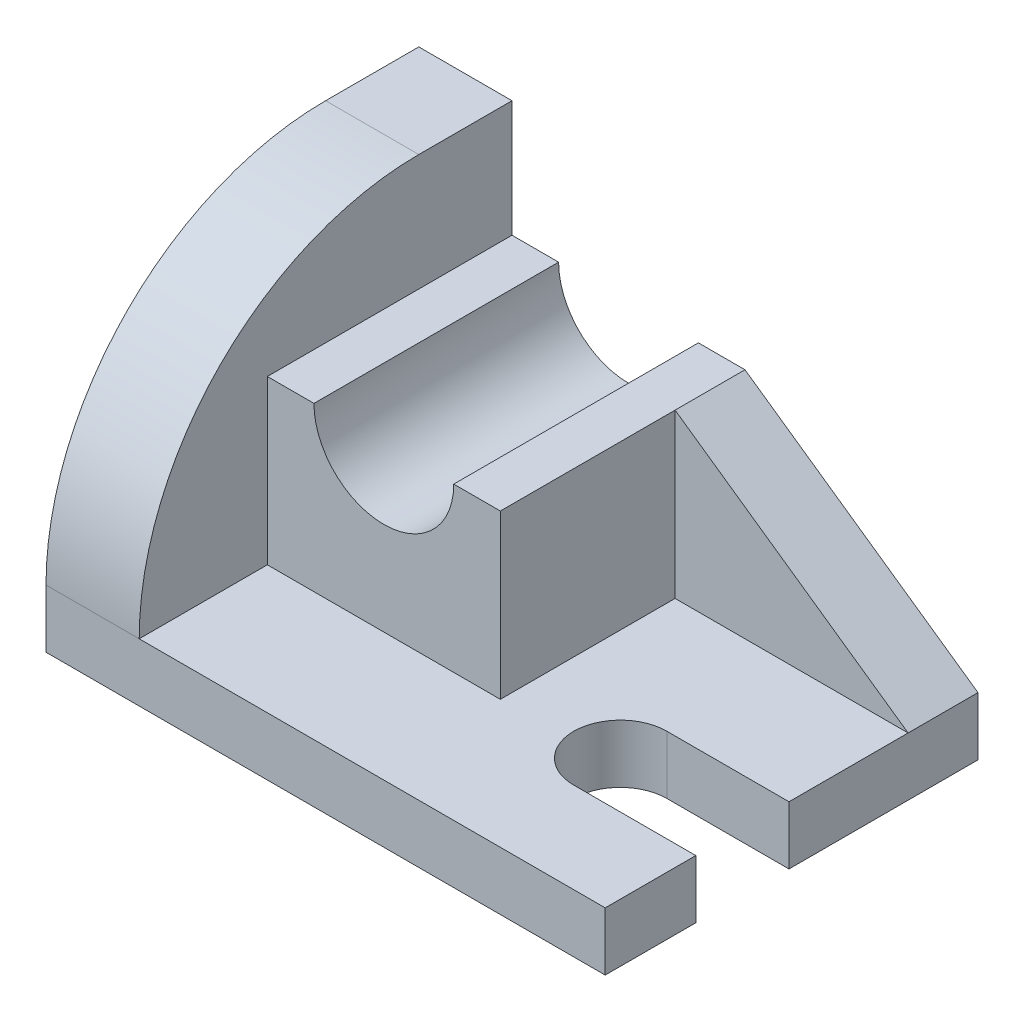
ISO-10303-21;
HEADER;
FILE_DESCRIPTION(('STEP AP214'),'2;1');
FILE_NAME('part.step','',(''),(''),'','','');
FILE_SCHEMA(('AUTOMOTIVE_DESIGN { 1 0 10303 214 1 1 1 1 }'));
ENDSEC;
DATA;
#1=APPLICATION_CONTEXT('core data for automotive mechanical design processes');
#2=APPLICATION_PROTOCOL_DEFINITION('international standard','automotive_design',2000,#1);
#3=PRODUCT_CONTEXT('',#1,'mechanical');
#4=PRODUCT('Part','Part','',(#3));
#5=PRODUCT_RELATED_PRODUCT_CATEGORY('part','',(#4));
#6=PRODUCT_DEFINITION_FORMATION('','',#4);
#7=PRODUCT_DEFINITION_CONTEXT('part definition',#1,'design');
#8=PRODUCT_DEFINITION('design','',#6,#7);
#9=PRODUCT_DEFINITION_SHAPE('','',#8);
#10=(LENGTH_UNIT() NAMED_UNIT(*) SI_UNIT(.MILLI.,.METRE.));
#11=(NAMED_UNIT(*) PLANE_ANGLE_UNIT() SI_UNIT($,.RADIAN.));
#12=(NAMED_UNIT(*) SI_UNIT($,.STERADIAN.) SOLID_ANGLE_UNIT());
#13=UNCERTAINTY_MEASURE_WITH_UNIT(LENGTH_MEASURE(1.E-05),#10,'distance_accuracy_value','');
#14=(GEOMETRIC_REPRESENTATION_CONTEXT(3) GLOBAL_UNCERTAINTY_ASSIGNED_CONTEXT((#13)) GLOBAL_UNIT_ASSIGNED_CONTEXT((#10,
#11,#12)) REPRESENTATION_CONTEXT('',''));
#15=CARTESIAN_POINT('',(0.,0.,0.));
#16=DIRECTION('',(0.,0.,1.));
#17=DIRECTION('',(1.,0.,0.));
#18=AXIS2_PLACEMENT_3D('',#15,#16,#17);
#19=CARTESIAN_POINT('',(16.,58.,-64.));
#20=DIRECTION('',(1.,0.,0.));
#21=DIRECTION('',(0.,1.,0.));
#22=AXIS2_PLACEMENT_3D('',#19,#20,#21);
#23=PLANE('',#22);
#24=DIRECTION('',(0.,-1.,0.));
#25=VECTOR('',#24,1.);
#26=CARTESIAN_POINT('',(16.,10.,-22.));
#27=LINE('',#26,#25);
#28=CARTESIAN_POINT('',(16.,38.,-22.));
#29=VERTEX_POINT('',#28);
#30=CARTESIAN_POINT('',(16.,10.,-22.));
#31=VERTEX_POINT('',#30);
#32=EDGE_CURVE('E49',#29,#31,#27,.T.);
#33=ORIENTED_EDGE('',*,*,#32,.F.);
#34=DIRECTION('',(0.,0.,-1.));
#35=VECTOR('',#34,1.);
#36=CARTESIAN_POINT('',(16.,38.,-22.));
#37=LINE('',#36,#35);
#38=CARTESIAN_POINT('',(16.,38.,-64.));
#39=VERTEX_POINT('',#38);
#40=EDGE_CURVE('E54',#29,#39,#37,.T.);
#41=ORIENTED_EDGE('',*,*,#40,.T.);
#42=DIRECTION('',(0.,1.,0.));
#43=VECTOR('',#42,1.);
#44=CARTESIAN_POINT('',(16.,58.,-64.));
#45=LINE('',#44,#43);
#46=CARTESIAN_POINT('',(16.,58.,-64.));
#47=VERTEX_POINT('',#46);
#48=EDGE_CURVE('E198',#39,#47,#45,.T.);
#49=ORIENTED_EDGE('',*,*,#48,.T.);
#50=DIRECTION('',(0.,0.,1.));
#51=VECTOR('',#50,1.);
#52=CARTESIAN_POINT('',(16.,58.,-64.));
#53=LINE('',#52,#51);
#54=CARTESIAN_POINT('',(16.,58.,-48.));
#55=VERTEX_POINT('',#54);
#56=EDGE_CURVE('E208',#47,#55,#53,.T.);
#57=ORIENTED_EDGE('',*,*,#56,.T.);
#58=CARTESIAN_POINT('',(16.,10.,-48.));
#59=DIRECTION('',(1.,0.,0.));
#60=DIRECTION('',(0.,1.,0.));
#61=AXIS2_PLACEMENT_3D('',#58,#59,#60);
#62=CIRCLE('',#61,48.);
#63=CARTESIAN_POINT('',(16.,10.,0.));
#64=VERTEX_POINT('',#63);
#65=EDGE_CURVE('E189',#55,#64,#62,.T.);
#66=ORIENTED_EDGE('',*,*,#65,.T.);
#67=DIRECTION('',(0.,0.,1.));
#68=VECTOR('',#67,1.);
#69=CARTESIAN_POINT('',(16.,10.,-64.));
#70=LINE('',#69,#68);
#71=EDGE_CURVE('E203',#31,#64,#70,.T.);
#72=ORIENTED_EDGE('',*,*,#71,.F.);
#73=EDGE_LOOP('',(#33,#41,#49,#57,#66,#72));
#74=FACE_BOUND('',#73,.T.);
#75=ADVANCED_FACE('F33',(#74),#23,.T.);
#76=CARTESIAN_POINT('',(0.,10.,0.));
#77=DIRECTION('',(0.,-1.,0.));
#78=DIRECTION('',(0.,0.,-1.));
#79=AXIS2_PLACEMENT_3D('',#76,#77,#78);
#80=PLANE('',#79);
#81=DIRECTION('',(0.,0.,-1.));
#82=VECTOR('',#81,1.);
#83=CARTESIAN_POINT('',(96.,10.,-64.));
#84=LINE('',#83,#82);
#85=CARTESIAN_POINT('',(96.,10.,-31.5509225220339));
#86=VERTEX_POINT('',#85);
#87=CARTESIAN_POINT('',(96.,10.,-52.));
#88=VERTEX_POINT('',#87);
#89=EDGE_CURVE('E240',#86,#88,#84,.T.);
#90=ORIENTED_EDGE('',*,*,#89,.T.);
#91=DIRECTION('',(-1.,0.,0.));
#92=VECTOR('',#91,1.);
#93=CARTESIAN_POINT('',(96.,10.,-52.));
#94=LINE('',#93,#92);
#95=CARTESIAN_POINT('',(56.,10.,-52.));
#96=VERTEX_POINT('',#95);
#97=EDGE_CURVE('E161',#88,#96,#94,.T.);
#98=ORIENTED_EDGE('',*,*,#97,.T.);
#99=DIRECTION('',(0.,0.,-1.));
#100=VECTOR('',#99,1.);
#101=CARTESIAN_POINT('',(56.,10.,-22.));
#102=LINE('',#101,#100);
#103=CARTESIAN_POINT('',(56.,10.,-22.));
#104=VERTEX_POINT('',#103);
#105=EDGE_CURVE('E177',#104,#96,#102,.T.);
#106=ORIENTED_EDGE('',*,*,#105,.F.);
#107=DIRECTION('',(1.,0.,0.));
#108=VECTOR('',#107,1.);
#109=CARTESIAN_POINT('',(0.,10.,-22.));
#110=LINE('',#109,#108);
#111=EDGE_CURVE('E323',#31,#104,#110,.T.);
#112=ORIENTED_EDGE('',*,*,#111,.F.);
#113=ORIENTED_EDGE('',*,*,#71,.T.);
#114=DIRECTION('',(1.,0.,0.));
#115=VECTOR('',#114,1.);
#116=CARTESIAN_POINT('',(96.,10.,0.));
#117=LINE('',#116,#115);
#118=CARTESIAN_POINT('',(96.,10.,0.));
#119=VERTEX_POINT('',#118);
#120=EDGE_CURVE('E238',#64,#119,#117,.T.);
#121=ORIENTED_EDGE('',*,*,#120,.T.);
#122=CARTESIAN_POINT('',(96.,10.,-15.5509225220339));
#123=VERTEX_POINT('',#122);
#124=EDGE_CURVE('E242',#119,#123,#84,.T.);
#125=ORIENTED_EDGE('',*,*,#124,.T.);
#126=DIRECTION('',(1.,0.,0.));
#127=VECTOR('',#126,1.);
#128=CARTESIAN_POINT('',(96.,10.,-15.5509225220339));
#129=LINE('',#128,#127);
#130=CARTESIAN_POINT('',(75.0432997423729,10.,-15.5509225220339));
#131=VERTEX_POINT('',#130);
#132=EDGE_CURVE('E207',#131,#123,#129,.T.);
#133=ORIENTED_EDGE('',*,*,#132,.F.);
#134=CARTESIAN_POINT('',(75.0432997423729,10.,-23.5509225220339));
#135=DIRECTION('',(0.,1.,0.));
#136=DIRECTION('',(0.,0.,1.));
#137=AXIS2_PLACEMENT_3D('',#134,#135,#136);
#138=CIRCLE('',#137,8.);
#139=CARTESIAN_POINT('',(75.0432997423729,10.,-31.5509225220339));
#140=VERTEX_POINT('',#139);
#141=EDGE_CURVE('E216',#140,#131,#138,.T.);
#142=ORIENTED_EDGE('',*,*,#141,.F.);
#143=DIRECTION('',(-1.,0.,0.));
#144=VECTOR('',#143,1.);
#145=CARTESIAN_POINT('',(96.,10.,-31.5509225220339));
#146=LINE('',#145,#144);
#147=EDGE_CURVE('E224',#86,#140,#146,.T.);
#148=ORIENTED_EDGE('',*,*,#147,.F.);
#149=EDGE_LOOP('',(#90,#98,#106,#112,#113,#121,#125,#133,#142,#148));
#150=FACE_BOUND('',#149,.T.);
#151=ADVANCED_FACE('F291',(#150),#80,.F.);
#152=CARTESIAN_POINT('',(96.,10.,0.));
#153=DIRECTION('',(0.,0.,-1.));
#154=DIRECTION('',(-1.,0.,0.));
#155=AXIS2_PLACEMENT_3D('',#152,#153,#154);
#156=PLANE('',#155);
#157=DIRECTION('',(-1.,0.,0.));
#158=VECTOR('',#157,1.);
#159=CARTESIAN_POINT('',(96.001,10.,0.));
#160=LINE('',#159,#158);
#161=CARTESIAN_POINT('',(0.,10.,0.));
#162=VERTEX_POINT('',#161);
#163=EDGE_CURVE('E192',#64,#162,#160,.T.);
#164=ORIENTED_EDGE('',*,*,#163,.T.);
#165=DIRECTION('',(0.,-1.,0.));
#166=VECTOR('',#165,1.);
#167=CARTESIAN_POINT('',(0.,10.,0.));
#168=LINE('',#167,#166);
#169=CARTESIAN_POINT('',(0.,0.,0.));
#170=VERTEX_POINT('',#169);
#171=EDGE_CURVE('E245',#162,#170,#168,.T.);
#172=ORIENTED_EDGE('',*,*,#171,.T.);
#173=DIRECTION('',(1.,0.,0.));
#174=VECTOR('',#173,1.);
#175=CARTESIAN_POINT('',(96.,0.,0.));
#176=LINE('',#175,#174);
#177=CARTESIAN_POINT('',(96.,0.,0.));
#178=VERTEX_POINT('',#177);
#179=EDGE_CURVE('E231',#170,#178,#176,.T.);
#180=ORIENTED_EDGE('',*,*,#179,.T.);
#181=DIRECTION('',(0.,-1.,0.));
#182=VECTOR('',#181,1.);
#183=CARTESIAN_POINT('',(96.,10.,0.));
#184=LINE('',#183,#182);
#185=EDGE_CURVE('E11',#119,#178,#184,.T.);
#186=ORIENTED_EDGE('',*,*,#185,.F.);
#187=ORIENTED_EDGE('',*,*,#120,.F.);
#188=EDGE_LOOP('',(#164,#172,#180,#186,#187));
#189=FACE_BOUND('',#188,.T.);
#190=ADVANCED_FACE('F35',(#189),#156,.F.);
#191=CARTESIAN_POINT('',(0.,10.,0.));
#192=DIRECTION('',(1.,0.,0.));
#193=DIRECTION('',(0.,0.,-1.));
#194=AXIS2_PLACEMENT_3D('',#191,#192,#193);
#195=PLANE('',#194);
#196=ORIENTED_EDGE('',*,*,#171,.F.);
#197=CARTESIAN_POINT('',(0.,10.,-48.));
#198=DIRECTION('',(-1.,0.,0.));
#199=DIRECTION('',(0.,0.,1.));
#200=AXIS2_PLACEMENT_3D('',#197,#198,#199);
#201=CIRCLE('',#200,48.);
#202=CARTESIAN_POINT('',(0.,58.,-48.));
#203=VERTEX_POINT('',#202);
#204=EDGE_CURVE('E37',#203,#162,#201,.F.);
#205=ORIENTED_EDGE('',*,*,#204,.F.);
#206=DIRECTION('',(0.,0.,1.));
#207=VECTOR('',#206,1.);
#208=CARTESIAN_POINT('',(0.,58.,-64.));
#209=LINE('',#208,#207);
#210=CARTESIAN_POINT('',(0.,58.,-64.));
#211=VERTEX_POINT('',#210);
#212=EDGE_CURVE('E204',#211,#203,#209,.T.);
#213=ORIENTED_EDGE('',*,*,#212,.F.);
#214=DIRECTION('',(0.,-1.,0.));
#215=VECTOR('',#214,1.);
#216=CARTESIAN_POINT('',(0.,10.,-64.));
#217=LINE('',#216,#215);
#218=CARTESIAN_POINT('',(0.,0.,-64.));
#219=VERTEX_POINT('',#218);
#220=EDGE_CURVE('E257',#211,#219,#217,.T.);
#221=ORIENTED_EDGE('',*,*,#220,.T.);
#222=DIRECTION('',(0.,0.,1.));
#223=VECTOR('',#222,1.);
#224=CARTESIAN_POINT('',(0.,0.,0.));
#225=LINE('',#224,#223);
#226=EDGE_CURVE('E241',#219,#170,#225,.T.);
#227=ORIENTED_EDGE('',*,*,#226,.T.);
#228=EDGE_LOOP('',(#196,#205,#213,#221,#227));
#229=FACE_BOUND('',#228,.T.);
#230=ADVANCED_FACE('F273',(#229),#195,.F.);
#231=CARTESIAN_POINT('',(0.,58.,-64.));
#232=DIRECTION('',(0.,1.,0.));
#233=DIRECTION('',(0.,0.,1.));
#234=AXIS2_PLACEMENT_3D('',#231,#232,#233);
#235=PLANE('',#234);
#236=ORIENTED_EDGE('',*,*,#212,.T.);
#237=DIRECTION('',(-1.,0.,0.));
#238=VECTOR('',#237,1.);
#239=CARTESIAN_POINT('',(96.001,58.,-48.));
#240=LINE('',#239,#238);
#241=EDGE_CURVE('E193',#55,#203,#240,.T.);
#242=ORIENTED_EDGE('',*,*,#241,.F.);
#243=ORIENTED_EDGE('',*,*,#56,.F.);
#244=DIRECTION('',(-1.,0.,0.));
#245=VECTOR('',#244,1.);
#246=CARTESIAN_POINT('',(0.,58.,-64.));
#247=LINE('',#246,#245);
#248=EDGE_CURVE('E200',#47,#211,#247,.T.);
#249=ORIENTED_EDGE('',*,*,#248,.T.);
#250=EDGE_LOOP('',(#236,#242,#243,#249));
#251=FACE_BOUND('',#250,.T.);
#252=ADVANCED_FACE('F281',(#251),#235,.T.);
#253=CARTESIAN_POINT('',(96.,10.,-64.));
#254=DIRECTION('',(-1.,0.,0.));
#255=DIRECTION('',(0.,0.,1.));
#256=AXIS2_PLACEMENT_3D('',#253,#254,#255);
#257=PLANE('',#256);
#258=DIRECTION('',(0.,0.,-1.));
#259=VECTOR('',#258,1.);
#260=CARTESIAN_POINT('',(96.,0.,-64.));
#261=LINE('',#260,#259);
#262=CARTESIAN_POINT('',(96.,0.,-15.5509225220339));
#263=VERTEX_POINT('',#262);
#264=EDGE_CURVE('E249',#178,#263,#261,.T.);
#265=ORIENTED_EDGE('',*,*,#264,.T.);
#266=DIRECTION('',(0.,1.,0.));
#267=VECTOR('',#266,1.);
#268=CARTESIAN_POINT('',(96.,0.,-15.5509225220339));
#269=LINE('',#268,#267);
#270=EDGE_CURVE('E222',#263,#123,#269,.T.);
#271=ORIENTED_EDGE('',*,*,#270,.T.);
#272=ORIENTED_EDGE('',*,*,#124,.F.);
#273=ORIENTED_EDGE('',*,*,#185,.T.);
#274=EDGE_LOOP('',(#265,#271,#272,#273));
#275=FACE_BOUND('',#274,.T.);
#276=ADVANCED_FACE('F294',(#275),#257,.F.);
#277=ORIENTED_EDGE('',*,*,#89,.F.);
#278=DIRECTION('',(0.,1.,0.));
#279=VECTOR('',#278,1.);
#280=CARTESIAN_POINT('',(96.,0.,-31.5509225220339));
#281=LINE('',#280,#279);
#282=CARTESIAN_POINT('',(96.,0.,-31.5509225220339));
#283=VERTEX_POINT('',#282);
#284=EDGE_CURVE('E234',#283,#86,#281,.T.);
#285=ORIENTED_EDGE('',*,*,#284,.F.);
#286=CARTESIAN_POINT('',(96.,0.,-64.));
#287=VERTEX_POINT('',#286);
#288=EDGE_CURVE('E248',#283,#287,#261,.T.);
#289=ORIENTED_EDGE('',*,*,#288,.T.);
#290=DIRECTION('',(0.,-1.,0.));
#291=VECTOR('',#290,1.);
#292=CARTESIAN_POINT('',(96.,10.,-64.));
#293=LINE('',#292,#291);
#294=CARTESIAN_POINT('',(96.,10.,-64.));
#295=VERTEX_POINT('',#294);
#296=EDGE_CURVE('E42',#295,#287,#293,.T.);
#297=ORIENTED_EDGE('',*,*,#296,.F.);
#298=DIRECTION('',(0.,0.,-1.));
#299=VECTOR('',#298,1.);
#300=CARTESIAN_POINT('',(96.,10.,-52.));
#301=LINE('',#300,#299);
#302=EDGE_CURVE('E160',#88,#295,#301,.T.);
#303=ORIENTED_EDGE('',*,*,#302,.F.);
#304=EDGE_LOOP('',(#277,#285,#289,#297,#303));
#305=FACE_BOUND('',#304,.T.);
#306=ADVANCED_FACE('F307',(#305),#257,.F.);
#307=CARTESIAN_POINT('',(0.,10.,-64.));
#308=DIRECTION('',(0.,0.,1.));
#309=DIRECTION('',(1.,0.,0.));
#310=AXIS2_PLACEMENT_3D('',#307,#308,#309);
#311=PLANE('',#310);
#312=ORIENTED_EDGE('',*,*,#48,.F.);
#313=DIRECTION('',(-1.,0.,0.));
#314=VECTOR('',#313,1.);
#315=CARTESIAN_POINT('',(0.,38.,-64.));
#316=LINE('',#315,#314);
#317=CARTESIAN_POINT('',(24.,38.,-64.));
#318=VERTEX_POINT('',#317);
#319=EDGE_CURVE('E319',#318,#39,#316,.T.);
#320=ORIENTED_EDGE('',*,*,#319,.F.);
#321=CARTESIAN_POINT('',(36.,38.,-64.));
#322=DIRECTION('',(0.,0.,1.));
#323=DIRECTION('',(1.,0.,0.));
#324=AXIS2_PLACEMENT_3D('',#321,#322,#323);
#325=CIRCLE('',#324,12.);
#326=CARTESIAN_POINT('',(48.,38.,-64.));
#327=VERTEX_POINT('',#326);
#328=EDGE_CURVE('E308',#318,#327,#325,.T.);
#329=ORIENTED_EDGE('',*,*,#328,.T.);
#330=DIRECTION('',(-1.,0.,0.));
#331=VECTOR('',#330,1.);
#332=CARTESIAN_POINT('',(0.,38.,-64.));
#333=LINE('',#332,#331);
#334=CARTESIAN_POINT('',(56.,38.,-64.));
#335=VERTEX_POINT('',#334);
#336=EDGE_CURVE('E311',#335,#327,#333,.T.);
#337=ORIENTED_EDGE('',*,*,#336,.F.);
#338=DIRECTION('',(0.81923192051904,-0.573462344363328,0.));
#339=VECTOR('',#338,1.);
#340=CARTESIAN_POINT('',(56.,38.,-64.));
#341=LINE('',#340,#339);
#342=EDGE_CURVE('E155',#335,#295,#341,.T.);
#343=ORIENTED_EDGE('',*,*,#342,.T.);
#344=ORIENTED_EDGE('',*,*,#296,.T.);
#345=DIRECTION('',(-1.,0.,0.));
#346=VECTOR('',#345,1.);
#347=CARTESIAN_POINT('',(0.,0.,-64.));
#348=LINE('',#347,#346);
#349=EDGE_CURVE('E252',#287,#219,#348,.T.);
#350=ORIENTED_EDGE('',*,*,#349,.T.);
#351=ORIENTED_EDGE('',*,*,#220,.F.);
#352=ORIENTED_EDGE('',*,*,#248,.F.);
#353=EDGE_LOOP('',(#312,#320,#329,#337,#343,#344,#350,#351,#352));
#354=FACE_BOUND('',#353,.T.);
#355=ADVANCED_FACE('F264',(#354),#311,.F.);
#356=CARTESIAN_POINT('',(0.,0.,0.));
#357=DIRECTION('',(0.,-1.,0.));
#358=DIRECTION('',(0.,0.,-1.));
#359=AXIS2_PLACEMENT_3D('',#356,#357,#358);
#360=PLANE('',#359);
#361=DIRECTION('',(1.,0.,0.));
#362=VECTOR('',#361,1.);
#363=CARTESIAN_POINT('',(96.,0.,-15.5509225220339));
#364=LINE('',#363,#362);
#365=CARTESIAN_POINT('',(75.0432997423729,0.,-15.5509225220339));
#366=VERTEX_POINT('',#365);
#367=EDGE_CURVE('E212',#366,#263,#364,.T.);
#368=ORIENTED_EDGE('',*,*,#367,.T.);
#369=ORIENTED_EDGE('',*,*,#264,.F.);
#370=ORIENTED_EDGE('',*,*,#179,.F.);
#371=ORIENTED_EDGE('',*,*,#226,.F.);
#372=ORIENTED_EDGE('',*,*,#349,.F.);
#373=ORIENTED_EDGE('',*,*,#288,.F.);
#374=DIRECTION('',(-1.,0.,0.));
#375=VECTOR('',#374,1.);
#376=CARTESIAN_POINT('',(96.,0.,-31.5509225220339));
#377=LINE('',#376,#375);
#378=CARTESIAN_POINT('',(75.0432997423729,0.,-31.5509225220339));
#379=VERTEX_POINT('',#378);
#380=EDGE_CURVE('E215',#283,#379,#377,.T.);
#381=ORIENTED_EDGE('',*,*,#380,.T.);
#382=CARTESIAN_POINT('',(75.0432997423729,0.,-23.5509225220339));
#383=DIRECTION('',(0.,1.,0.));
#384=DIRECTION('',(0.,0.,1.));
#385=AXIS2_PLACEMENT_3D('',#382,#383,#384);
#386=CIRCLE('',#385,8.);
#387=EDGE_CURVE('E219',#379,#366,#386,.T.);
#388=ORIENTED_EDGE('',*,*,#387,.T.);
#389=EDGE_LOOP('',(#368,#369,#370,#371,#372,#373,#381,#388));
#390=FACE_BOUND('',#389,.T.);
#391=ADVANCED_FACE('F269',(#390),#360,.T.);
#392=CARTESIAN_POINT('',(96.,0.,-15.5509225220339));
#393=DIRECTION('',(0.,0.,1.));
#394=DIRECTION('',(1.,0.,0.));
#395=AXIS2_PLACEMENT_3D('',#392,#393,#394);
#396=PLANE('',#395);
#397=ORIENTED_EDGE('',*,*,#132,.T.);
#398=ORIENTED_EDGE('',*,*,#270,.F.);
#399=ORIENTED_EDGE('',*,*,#367,.F.);
#400=DIRECTION('',(0.,1.,0.));
#401=VECTOR('',#400,1.);
#402=CARTESIAN_POINT('',(75.0432997423729,0.,-15.5509225220339));
#403=LINE('',#402,#401);
#404=EDGE_CURVE('E229',#366,#131,#403,.T.);
#405=ORIENTED_EDGE('',*,*,#404,.T.);
#406=EDGE_LOOP('',(#397,#398,#399,#405));
#407=FACE_BOUND('',#406,.T.);
#408=ADVANCED_FACE('F297',(#407),#396,.F.);
#409=CARTESIAN_POINT('',(75.0432997423729,0.,-23.5509225220339));
#410=DIRECTION('',(0.,1.,0.));
#411=DIRECTION('',(0.,0.,1.));
#412=AXIS2_PLACEMENT_3D('',#409,#410,#411);
#413=CYLINDRICAL_SURFACE('',#412,8.);
#414=ORIENTED_EDGE('',*,*,#141,.T.);
#415=ORIENTED_EDGE('',*,*,#404,.F.);
#416=ORIENTED_EDGE('',*,*,#387,.F.);
#417=DIRECTION('',(0.,1.,0.));
#418=VECTOR('',#417,1.);
#419=CARTESIAN_POINT('',(75.0432997423729,0.,-31.5509225220339));
#420=LINE('',#419,#418);
#421=EDGE_CURVE('E232',#379,#140,#420,.T.);
#422=ORIENTED_EDGE('',*,*,#421,.T.);
#423=EDGE_LOOP('',(#414,#415,#416,#422));
#424=FACE_BOUND('',#423,.T.);
#425=ADVANCED_FACE('F300',(#424),#413,.F.);
#426=CARTESIAN_POINT('',(96.,0.,-31.5509225220339));
#427=DIRECTION('',(0.,0.,-1.));
#428=DIRECTION('',(-1.,0.,0.));
#429=AXIS2_PLACEMENT_3D('',#426,#427,#428);
#430=PLANE('',#429);
#431=ORIENTED_EDGE('',*,*,#147,.T.);
#432=ORIENTED_EDGE('',*,*,#421,.F.);
#433=ORIENTED_EDGE('',*,*,#380,.F.);
#434=ORIENTED_EDGE('',*,*,#284,.T.);
#435=EDGE_LOOP('',(#431,#432,#433,#434));
#436=FACE_BOUND('',#435,.T.);
#437=ADVANCED_FACE('F302',(#436),#430,.F.);
#438=CARTESIAN_POINT('',(96.001,10.,-48.));
#439=DIRECTION('',(-1.,0.,0.));
#440=DIRECTION('',(0.,0.,1.));
#441=AXIS2_PLACEMENT_3D('',#438,#439,#440);
#442=CYLINDRICAL_SURFACE('',#441,48.);
#443=ORIENTED_EDGE('',*,*,#163,.F.);
#444=ORIENTED_EDGE('',*,*,#65,.F.);
#445=ORIENTED_EDGE('',*,*,#241,.T.);
#446=ORIENTED_EDGE('',*,*,#204,.T.);
#447=EDGE_LOOP('',(#443,#444,#445,#446));
#448=FACE_BOUND('',#447,.T.);
#449=ADVANCED_FACE('F361',(#448),#442,.T.);
#450=CARTESIAN_POINT('',(36.,38.,-22.));
#451=DIRECTION('',(0.,0.,-1.));
#452=DIRECTION('',(-1.,0.,0.));
#453=AXIS2_PLACEMENT_3D('',#450,#451,#452);
#454=CYLINDRICAL_SURFACE('',#453,12.);
#455=ORIENTED_EDGE('',*,*,#328,.F.);
#456=DIRECTION('',(0.,0.,-1.));
#457=VECTOR('',#456,1.);
#458=CARTESIAN_POINT('',(24.,38.,-22.));
#459=LINE('',#458,#457);
#460=CARTESIAN_POINT('',(24.,38.,-22.));
#461=VERTEX_POINT('',#460);
#462=EDGE_CURVE('E195',#461,#318,#459,.T.);
#463=ORIENTED_EDGE('',*,*,#462,.F.);
#464=CARTESIAN_POINT('',(36.,38.,-22.));
#465=DIRECTION('',(0.,0.,1.));
#466=DIRECTION('',(1.,0.,0.));
#467=AXIS2_PLACEMENT_3D('',#464,#465,#466);
#468=CIRCLE('',#467,12.);
#469=CARTESIAN_POINT('',(48.,38.,-22.));
#470=VERTEX_POINT('',#469);
#471=EDGE_CURVE('E316',#461,#470,#468,.T.);
#472=ORIENTED_EDGE('',*,*,#471,.T.);
#473=DIRECTION('',(0.,0.,-1.));
#474=VECTOR('',#473,1.);
#475=CARTESIAN_POINT('',(48.,38.,-22.));
#476=LINE('',#475,#474);
#477=EDGE_CURVE('E182',#470,#327,#476,.T.);
#478=ORIENTED_EDGE('',*,*,#477,.T.);
#479=EDGE_LOOP('',(#455,#463,#472,#478));
#480=FACE_BOUND('',#479,.T.);
#481=ADVANCED_FACE('F336',(#480),#454,.F.);
#482=CARTESIAN_POINT('',(0.,38.,-22.));
#483=DIRECTION('',(0.,-1.,0.));
#484=DIRECTION('',(0.,0.,-1.));
#485=AXIS2_PLACEMENT_3D('',#482,#483,#484);
#486=PLANE('',#485);
#487=ORIENTED_EDGE('',*,*,#319,.T.);
#488=ORIENTED_EDGE('',*,*,#40,.F.);
#489=DIRECTION('',(-1.,0.,0.));
#490=VECTOR('',#489,1.);
#491=CARTESIAN_POINT('',(0.,38.,-22.));
#492=LINE('',#491,#490);
#493=EDGE_CURVE('E185',#461,#29,#492,.T.);
#494=ORIENTED_EDGE('',*,*,#493,.F.);
#495=ORIENTED_EDGE('',*,*,#462,.T.);
#496=EDGE_LOOP('',(#487,#488,#494,#495));
#497=FACE_BOUND('',#496,.T.);
#498=ADVANCED_FACE('F332',(#497),#486,.F.);
#499=CARTESIAN_POINT('',(56.,10.,-22.));
#500=DIRECTION('',(-1.,0.,0.));
#501=DIRECTION('',(0.,0.,1.));
#502=AXIS2_PLACEMENT_3D('',#499,#500,#501);
#503=PLANE('',#502);
#504=ORIENTED_EDGE('',*,*,#105,.T.);
#505=DIRECTION('',(0.,1.,0.));
#506=VECTOR('',#505,1.);
#507=CARTESIAN_POINT('',(56.,10.,-52.));
#508=LINE('',#507,#506);
#509=CARTESIAN_POINT('',(56.,38.,-52.));
#510=VERTEX_POINT('',#509);
#511=EDGE_CURVE('E166',#96,#510,#508,.T.);
#512=ORIENTED_EDGE('',*,*,#511,.T.);
#513=DIRECTION('',(0.,0.,-1.));
#514=VECTOR('',#513,1.);
#515=CARTESIAN_POINT('',(56.,38.,-22.));
#516=LINE('',#515,#514);
#517=CARTESIAN_POINT('',(56.,38.,-22.));
#518=VERTEX_POINT('',#517);
#519=EDGE_CURVE('E175',#518,#510,#516,.T.);
#520=ORIENTED_EDGE('',*,*,#519,.F.);
#521=DIRECTION('',(0.,1.,0.));
#522=VECTOR('',#521,1.);
#523=CARTESIAN_POINT('',(56.,10.,-22.));
#524=LINE('',#523,#522);
#525=EDGE_CURVE('E321',#104,#518,#524,.T.);
#526=ORIENTED_EDGE('',*,*,#525,.F.);
#527=EDGE_LOOP('',(#504,#512,#520,#526));
#528=FACE_BOUND('',#527,.T.);
#529=ADVANCED_FACE('F173',(#528),#503,.F.);
#530=CARTESIAN_POINT('',(0.,38.,-22.));
#531=DIRECTION('',(0.,-1.,0.));
#532=DIRECTION('',(0.,0.,-1.));
#533=AXIS2_PLACEMENT_3D('',#530,#531,#532);
#534=PLANE('',#533);
#535=ORIENTED_EDGE('',*,*,#336,.T.);
#536=ORIENTED_EDGE('',*,*,#477,.F.);
#537=DIRECTION('',(-1.,0.,0.));
#538=VECTOR('',#537,1.);
#539=CARTESIAN_POINT('',(0.,38.,-22.));
#540=LINE('',#539,#538);
#541=EDGE_CURVE('E181',#518,#470,#540,.T.);
#542=ORIENTED_EDGE('',*,*,#541,.F.);
#543=ORIENTED_EDGE('',*,*,#519,.T.);
#544=DIRECTION('',(0.,0.,-1.));
#545=VECTOR('',#544,1.);
#546=CARTESIAN_POINT('',(56.,38.,-52.));
#547=LINE('',#546,#545);
#548=EDGE_CURVE('E149',#510,#335,#547,.T.);
#549=ORIENTED_EDGE('',*,*,#548,.T.);
#550=EDGE_LOOP('',(#535,#536,#542,#543,#549));
#551=FACE_BOUND('',#550,.T.);
#552=ADVANCED_FACE('F179',(#551),#534,.F.);
#553=CARTESIAN_POINT('',(36.,38.,-22.));
#554=DIRECTION('',(0.,0.,1.));
#555=DIRECTION('',(1.,0.,0.));
#556=AXIS2_PLACEMENT_3D('',#553,#554,#555);
#557=PLANE('',#556);
#558=ORIENTED_EDGE('',*,*,#471,.F.);
#559=ORIENTED_EDGE('',*,*,#493,.T.);
#560=ORIENTED_EDGE('',*,*,#32,.T.);
#561=ORIENTED_EDGE('',*,*,#111,.T.);
#562=ORIENTED_EDGE('',*,*,#525,.T.);
#563=ORIENTED_EDGE('',*,*,#541,.T.);
#564=EDGE_LOOP('',(#558,#559,#560,#561,#562,#563));
#565=FACE_BOUND('',#564,.T.);
#566=ADVANCED_FACE('F338',(#565),#557,.T.);
#567=CARTESIAN_POINT('',(56.,38.,-52.));
#568=DIRECTION('',(0.573462344363328,0.81923192051904,0.));
#569=DIRECTION('',(-0.81923192051904,0.573462344363328,0.));
#570=AXIS2_PLACEMENT_3D('',#567,#568,#569);
#571=PLANE('',#570);
#572=ORIENTED_EDGE('',*,*,#342,.F.);
#573=ORIENTED_EDGE('',*,*,#548,.F.);
#574=DIRECTION('',(0.81923192051904,-0.573462344363328,0.));
#575=VECTOR('',#574,1.);
#576=CARTESIAN_POINT('',(56.,38.,-52.));
#577=LINE('',#576,#575);
#578=EDGE_CURVE('E152',#510,#88,#577,.T.);
#579=ORIENTED_EDGE('',*,*,#578,.T.);
#580=ORIENTED_EDGE('',*,*,#302,.T.);
#581=EDGE_LOOP('',(#572,#573,#579,#580));
#582=FACE_BOUND('',#581,.T.);
#583=ADVANCED_FACE('F151',(#582),#571,.T.);
#584=CARTESIAN_POINT('',(0.,0.,-52.));
#585=DIRECTION('',(0.,0.,1.));
#586=DIRECTION('',(1.,0.,0.));
#587=AXIS2_PLACEMENT_3D('',#584,#585,#586);
#588=PLANE('',#587);
#589=ORIENTED_EDGE('',*,*,#511,.F.);
#590=ORIENTED_EDGE('',*,*,#97,.F.);
#591=ORIENTED_EDGE('',*,*,#578,.F.);
#592=EDGE_LOOP('',(#589,#590,#591));
#593=FACE_BOUND('',#592,.T.);
#594=ADVANCED_FACE('F165',(#593),#588,.T.);
#595=CLOSED_SHELL('',(#75,#151,#190,#230,#252,#276,#306,#355,#391,#408,#425,#437,#449,#481,#498,
#529,#552,#566,#583,#594));
#596=MANIFOLD_SOLID_BREP('B2',#595);
#597=ADVANCED_BREP_SHAPE_REPRESENTATION('',(#18,#596),#14);
#598=SHAPE_DEFINITION_REPRESENTATION(#9,#597);
ENDSEC;
END-ISO-10303-21;
